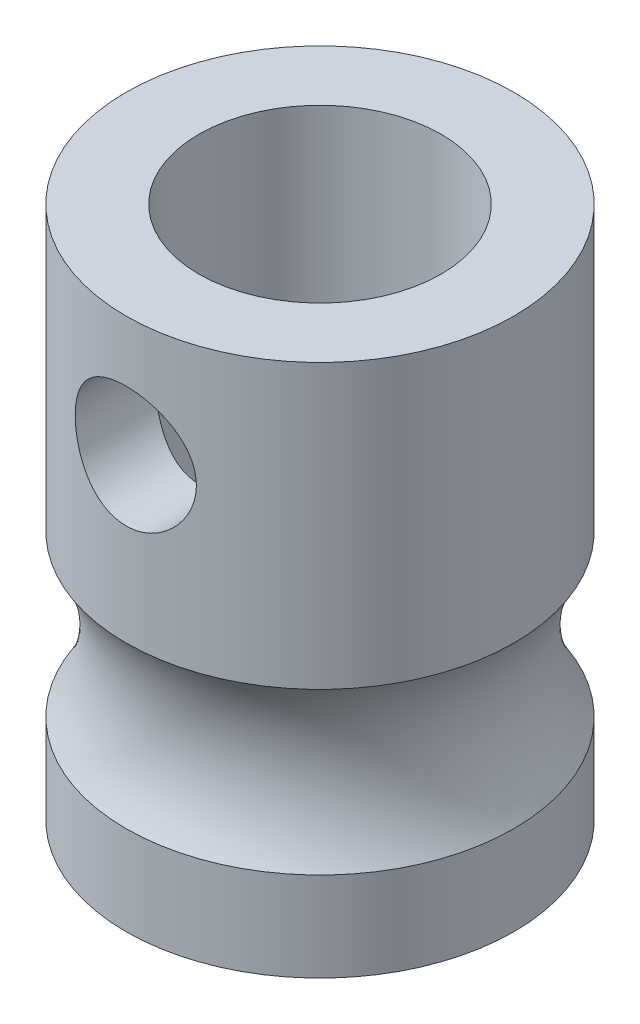
ISO-10303-21;
HEADER;
FILE_DESCRIPTION(('STEP AP214'),'2;1');
FILE_NAME('part.step','',(''),(''),'','','');
FILE_SCHEMA(('AUTOMOTIVE_DESIGN { 1 0 10303 214 1 1 1 1 }'));
ENDSEC;
DATA;
#1=APPLICATION_CONTEXT('core data for automotive mechanical design processes');
#2=APPLICATION_PROTOCOL_DEFINITION('international standard','automotive_design',2000,#1);
#3=PRODUCT_CONTEXT('',#1,'mechanical');
#4=PRODUCT('Part','Part','',(#3));
#5=PRODUCT_RELATED_PRODUCT_CATEGORY('part','',(#4));
#6=PRODUCT_DEFINITION_FORMATION('','',#4);
#7=PRODUCT_DEFINITION_CONTEXT('part definition',#1,'design');
#8=PRODUCT_DEFINITION('design','',#6,#7);
#9=PRODUCT_DEFINITION_SHAPE('','',#8);
#10=(LENGTH_UNIT() NAMED_UNIT(*) SI_UNIT(.MILLI.,.METRE.));
#11=(NAMED_UNIT(*) PLANE_ANGLE_UNIT() SI_UNIT($,.RADIAN.));
#12=(NAMED_UNIT(*) SI_UNIT($,.STERADIAN.) SOLID_ANGLE_UNIT());
#13=UNCERTAINTY_MEASURE_WITH_UNIT(LENGTH_MEASURE(1.E-05),#10,'distance_accuracy_value','');
#14=(GEOMETRIC_REPRESENTATION_CONTEXT(3) GLOBAL_UNCERTAINTY_ASSIGNED_CONTEXT((#13)) GLOBAL_UNIT_ASSIGNED_CONTEXT((#10,
#11,#12)) REPRESENTATION_CONTEXT('',''));
#15=CARTESIAN_POINT('',(0.,0.,0.));
#16=DIRECTION('',(0.,0.,1.));
#17=DIRECTION('',(1.,0.,0.));
#18=AXIS2_PLACEMENT_3D('',#15,#16,#17);
#19=CARTESIAN_POINT('',(0.,11.,0.));
#20=DIRECTION('',(0.,-1.,0.));
#21=DIRECTION('',(0.,0.,-1.));
#22=AXIS2_PLACEMENT_3D('',#19,#20,#21);
#23=CYLINDRICAL_SURFACE('',#22,4.);
#24=CARTESIAN_POINT('',(0.,11.,0.));
#25=DIRECTION('',(0.,1.,0.));
#26=DIRECTION('',(0.,0.,1.));
#27=AXIS2_PLACEMENT_3D('',#24,#25,#26);
#28=CIRCLE('',#27,4.);
#29=CARTESIAN_POINT('',(0.,11.,4.));
#30=VERTEX_POINT('',#29);
#31=EDGE_CURVE('E10',#30,#30,#28,.T.);
#32=ORIENTED_EDGE('',*,*,#31,.F.);
#33=EDGE_LOOP('',(#32));
#34=FACE_BOUND('',#33,.T.);
#35=CARTESIAN_POINT('',(1.25,8.5,3.79967103839267));
#36=CARTESIAN_POINT('',(1.24999953780047,8.43165296389066,3.79967145961936));
#37=CARTESIAN_POINT('',(1.24437538791494,8.3633012312968,3.80153531505043));
#38=CARTESIAN_POINT('',(1.22209175401327,8.22860583912219,3.80875638998877));
#39=CARTESIAN_POINT('',(1.20542928782515,8.16226272726784,3.81411455353136));
#40=CARTESIAN_POINT('',(1.16169788223559,8.033555098068,3.8276593883596));
#41=CARTESIAN_POINT('',(1.13464735736677,7.97118376689432,3.83584105194317));
#42=CARTESIAN_POINT('',(1.07096914173157,7.85184730413599,3.85410406218688));
#43=CARTESIAN_POINT('',(1.03433975905632,7.79488313003988,3.86418574435841));
#44=CARTESIAN_POINT('',(0.951196070622294,7.68602113250651,3.8855012766862));
#45=CARTESIAN_POINT('',(0.904409399720399,7.63433639056402,3.8967612338478));
#46=CARTESIAN_POINT('',(0.802862046455496,7.53940398679082,3.91894245860335));
#47=CARTESIAN_POINT('',(0.748100252518566,7.49615750305515,3.92986367872627));
#48=CARTESIAN_POINT('',(0.630625912493364,7.41838893698876,3.95043553390078));
#49=CARTESIAN_POINT('',(0.567761556520096,7.38408629616854,3.9600518456278));
#50=CARTESIAN_POINT('',(0.436804232853405,7.32662395014445,3.97662551833019));
#51=CARTESIAN_POINT('',(0.368712498487053,7.30346162585041,3.98358350419919));
#52=CARTESIAN_POINT('',(0.231464356966099,7.26964887190293,3.99387175820863));
#53=CARTESIAN_POINT('',(0.162405715468217,7.25863425021215,3.99730738984143));
#54=CARTESIAN_POINT('',(0.0233408139845221,7.24827565356247,4.00053595876015));
#55=CARTESIAN_POINT('',(-0.0466652269730815,7.24892902564117,4.00032972410065));
#56=CARTESIAN_POINT('',(-0.183074480354733,7.26164829158594,3.99637116132537));
#57=CARTESIAN_POINT('',(-0.249518634314042,7.27331938351302,3.99274150972157));
#58=CARTESIAN_POINT('',(-0.379453063347768,7.307094990043,3.98249482560855));
#59=CARTESIAN_POINT('',(-0.442943145481194,7.32920018508655,3.97587759827134));
#60=CARTESIAN_POINT('',(-0.566078103154779,7.38347018907488,3.96023459729533));
#61=CARTESIAN_POINT('',(-0.625666405622829,7.41575480856303,3.95118033616957));
#62=CARTESIAN_POINT('',(-0.738702511152028,7.48937109970456,3.93161722953562));
#63=CARTESIAN_POINT('',(-0.792148756208836,7.53070505913783,3.92110801644584));
#64=CARTESIAN_POINT('',(-0.893737698453879,7.62327363480129,3.89923670734646));
#65=CARTESIAN_POINT('',(-0.941566549094176,7.6748490688412,3.88785731989084));
#66=CARTESIAN_POINT('',(-1.02798974259537,7.78539510182446,3.86590615440412));
#67=CARTESIAN_POINT('',(-1.06658299775341,7.844366570575,3.85533447159847));
#68=CARTESIAN_POINT('',(-1.13380465019765,7.96891746885984,3.83610846648974));
#69=CARTESIAN_POINT('',(-1.16231680702682,8.03456340904239,3.82747690354324));
#70=CARTESIAN_POINT('',(-1.20778345948513,8.17005949189535,3.81337545338913));
#71=CARTESIAN_POINT('',(-1.22474210765793,8.23990811421048,3.80790443033294));
#72=CARTESIAN_POINT('',(-1.24601485185709,8.37881995256583,3.80099563391872));
#73=CARTESIAN_POINT('',(-1.25080954353711,8.4478019962321,3.79940466389696));
#74=CARTESIAN_POINT('',(-1.24896744498307,8.58558974149816,3.80001077463984));
#75=CARTESIAN_POINT('',(-1.24233242111456,8.65439546870046,3.80220727008389));
#76=CARTESIAN_POINT('',(-1.21824873513143,8.78780829665164,3.80998957482874));
#77=CARTESIAN_POINT('',(-1.20111831160538,8.85247927407399,3.81547554101732));
#78=CARTESIAN_POINT('',(-1.15690373661028,8.97802179199604,3.82911287331661));
#79=CARTESIAN_POINT('',(-1.12981796171155,9.03889271092119,3.83726467412388));
#80=CARTESIAN_POINT('',(-1.06557510655875,9.15703910977175,3.85560539653156));
#81=CARTESIAN_POINT('',(-1.02815147488557,9.21416141559277,3.86584603489733));
#82=CARTESIAN_POINT('',(-0.944606408679812,9.32149034636191,3.88710348972828));
#83=CARTESIAN_POINT('',(-0.898482714690784,9.37169516892533,3.89812050735703));
#84=CARTESIAN_POINT('',(-0.796572947753606,9.46591036591281,3.92024187562679));
#85=CARTESIAN_POINT('',(-0.740465649788522,9.50957778613986,3.93133092285679));
#86=CARTESIAN_POINT('',(-0.621451545651399,9.58689104332125,3.95189059843678));
#87=CARTESIAN_POINT('',(-0.558545051108625,9.62053733931103,3.96136130090946));
#88=CARTESIAN_POINT('',(-0.428105523331833,9.67653056247168,3.97756311928512));
#89=CARTESIAN_POINT('',(-0.360610184283757,9.69895928784368,3.984313995612));
#90=CARTESIAN_POINT('',(-0.22255725405639,9.7320725385897,3.99440242648576));
#91=CARTESIAN_POINT('',(-0.152000628340358,9.74276073908349,3.99774104914277));
#92=CARTESIAN_POINT('',(-0.0129849366489001,9.75179100174962,4.00055803404462));
#93=CARTESIAN_POINT('',(0.055439191946521,9.75062845017075,4.0001912940739));
#94=CARTESIAN_POINT('',(0.191073221923247,9.7371881889513,3.99600978081049));
#95=CARTESIAN_POINT('',(0.258283202179567,9.72491120400805,3.99219523232619));
#96=CARTESIAN_POINT('',(0.38875511848079,9.68990599077772,3.98159570844796));
#97=CARTESIAN_POINT('',(0.452055918449479,9.66731039215463,3.97484847960205));
#98=CARTESIAN_POINT('',(0.573998425500089,9.61242917279152,3.9590794558795));
#99=CARTESIAN_POINT('',(0.63263933127448,9.58014189002657,3.95005727091358));
#100=CARTESIAN_POINT('',(0.745761694969687,9.50552724165556,3.93029896883376));
#101=CARTESIAN_POINT('',(0.800034607053109,9.46289647753603,3.91951509750962));
#102=CARTESIAN_POINT('',(0.900820791399317,9.36934011055654,3.89758736547061));
#103=CARTESIAN_POINT('',(0.947331733504159,9.31841202586061,3.88644339784827));
#104=CARTESIAN_POINT('',(1.03282865911252,9.2076842801589,3.86461892577438));
#105=CARTESIAN_POINT('',(1.07151427994711,9.14764659688342,3.85396600863456));
#106=CARTESIAN_POINT('',(1.13820470748521,9.02160187973086,3.83480125279531));
#107=CARTESIAN_POINT('',(1.16621383403546,8.95559727354975,3.82628854861387));
#108=CARTESIAN_POINT('',(1.20871180435792,8.82527738268533,3.81306560440328));
#109=CARTESIAN_POINT('',(1.22414939837873,8.76129745254843,3.80809315043749));
#110=CARTESIAN_POINT('',(1.244792458161,8.63154616790351,3.80139606482399));
#111=CARTESIAN_POINT('',(1.25000044480778,8.5657752587985,3.79967063301598));
#112=CARTESIAN_POINT('',(1.25,8.5,3.79967103839267));
#113=B_SPLINE_CURVE_WITH_KNOTS('',3,(#35,#36,#37,#38,#39,#40,#41,#42,#43,#44,#45,#46,#47,#48,
#49,#50,#51,#52,#53,#54,#55,#56,#57,#58,#59,#60,#61,#62,#63,#64,#65,#66,#67,#68,#69,#70,#71,#72,
#73,#74,#75,#76,#77,#78,#79,#80,#81,#82,#83,#84,#85,#86,#87,#88,#89,#90,#91,#92,#93,#94,#95,#96,
#97,#98,#99,#100,#101,#102,#103,#104,#105,#106,#107,#108,#109,#110,#111,#112),.UNSPECIFIED.,.T.,
.F.,(4,2,2,2,2,2,2,2,2,2,2,2,2,2,2,2,2,2,2,2,2,2,2,2,2,2,2,2,2,2,2,2,2,2,2,2,2,2,4),(0.,
0.204798137548489,0.409651627059734,0.614143644118581,0.818671804924946,1.02957080550838,
1.24049922941122,1.45619821963733,1.67184647417922,1.88083722835533,2.08978046471774,
2.2915098296975,2.49325235190093,2.69746404608409,2.90172742713187,3.11450338937334,
3.32730439853776,3.54248470934454,3.75758763952752,3.96404933287935,4.17047912219089,
4.37093972044363,4.5714330225321,4.77767613309611,4.9839728801188,5.19881937811511,
5.41365603317086,5.62690239290998,5.84008198140585,6.04438802439525,6.24868074692307,
6.45041846514759,6.65219079911652,6.86080693105215,7.0694855777219,7.28507795501705,
7.50058300803822,7.69772354371386,7.89481549188779),.UNSPECIFIED.);
#114=CARTESIAN_POINT('',(1.25,8.5,3.79967103839267));
#115=VERTEX_POINT('',#114);
#116=EDGE_CURVE('E58',#115,#115,#113,.T.);
#117=ORIENTED_EDGE('',*,*,#116,.T.);
#118=EDGE_LOOP('',(#117));
#119=FACE_BOUND('',#118,.T.);
#120=CARTESIAN_POINT('',(0.,5.1583123951777,0.));
#121=DIRECTION('',(0.,-1.,0.));
#122=DIRECTION('',(0.,0.,-1.));
#123=AXIS2_PLACEMENT_3D('',#120,#121,#122);
#124=CIRCLE('',#123,4.);
#125=CARTESIAN_POINT('',(0.,5.1583123951777,-4.));
#126=VERTEX_POINT('',#125);
#127=EDGE_CURVE('E35',#126,#126,#124,.T.);
#128=ORIENTED_EDGE('',*,*,#127,.F.);
#129=EDGE_LOOP('',(#128));
#130=FACE_BOUND('',#129,.T.);
#131=ADVANCED_FACE('F31',(#34,#119,#130),#23,.T.);
#132=CARTESIAN_POINT('',(0.,0.,0.));
#133=DIRECTION('',(0.,1.,0.));
#134=DIRECTION('',(0.,0.,1.));
#135=AXIS2_PLACEMENT_3D('',#132,#133,#134);
#136=CIRCLE('',#135,4.);
#137=CARTESIAN_POINT('',(0.,0.,4.));
#138=VERTEX_POINT('',#137);
#139=EDGE_CURVE('E39',#138,#138,#136,.T.);
#140=ORIENTED_EDGE('',*,*,#139,.T.);
#141=EDGE_LOOP('',(#140));
#142=FACE_BOUND('',#141,.T.);
#143=CARTESIAN_POINT('',(0.,1.8416876048223,0.));
#144=DIRECTION('',(0.,1.,0.));
#145=DIRECTION('',(0.,0.,1.));
#146=AXIS2_PLACEMENT_3D('',#143,#144,#145);
#147=CIRCLE('',#146,4.);
#148=CARTESIAN_POINT('',(0.,1.8416876048223,4.));
#149=VERTEX_POINT('',#148);
#150=EDGE_CURVE('E49',#149,#149,#147,.T.);
#151=ORIENTED_EDGE('',*,*,#150,.F.);
#152=EDGE_LOOP('',(#151));
#153=FACE_BOUND('',#152,.T.);
#154=ADVANCED_FACE('F83',(#142,#153),#23,.T.);
#155=CARTESIAN_POINT('',(0.,11.,0.));
#156=DIRECTION('',(0.,1.,0.));
#157=DIRECTION('',(0.,0.,1.));
#158=AXIS2_PLACEMENT_3D('',#155,#156,#157);
#159=PLANE('',#158);
#160=ORIENTED_EDGE('',*,*,#31,.T.);
#161=EDGE_LOOP('',(#160));
#162=FACE_BOUND('',#161,.T.);
#163=CARTESIAN_POINT('',(0.,11.,0.));
#164=DIRECTION('',(0.,1.,0.));
#165=DIRECTION('',(0.,0.,1.));
#166=AXIS2_PLACEMENT_3D('',#163,#164,#165);
#167=CIRCLE('',#166,2.5);
#168=CARTESIAN_POINT('',(0.,11.,2.5));
#169=VERTEX_POINT('',#168);
#170=EDGE_CURVE('E44',#169,#169,#167,.T.);
#171=ORIENTED_EDGE('',*,*,#170,.F.);
#172=EDGE_LOOP('',(#171));
#173=FACE_BOUND('',#172,.T.);
#174=ADVANCED_FACE('F88',(#162,#173),#159,.T.);
#175=CARTESIAN_POINT('',(0.,0.,0.));
#176=DIRECTION('',(0.,1.,0.));
#177=DIRECTION('',(0.,0.,1.));
#178=AXIS2_PLACEMENT_3D('',#175,#176,#177);
#179=PLANE('',#178);
#180=ORIENTED_EDGE('',*,*,#139,.F.);
#181=EDGE_LOOP('',(#180));
#182=FACE_BOUND('',#181,.T.);
#183=CARTESIAN_POINT('',(0.,0.,0.));
#184=DIRECTION('',(0.,1.,0.));
#185=DIRECTION('',(0.,0.,1.));
#186=AXIS2_PLACEMENT_3D('',#183,#184,#185);
#187=CIRCLE('',#186,2.5);
#188=CARTESIAN_POINT('',(0.,0.,2.5));
#189=VERTEX_POINT('',#188);
#190=EDGE_CURVE('E47',#189,#189,#187,.T.);
#191=ORIENTED_EDGE('',*,*,#190,.T.);
#192=EDGE_LOOP('',(#191));
#193=FACE_BOUND('',#192,.T.);
#194=ADVANCED_FACE('F97',(#182,#193),#179,.F.);
#195=CARTESIAN_POINT('',(0.,11.,0.));
#196=DIRECTION('',(0.,-1.,0.));
#197=DIRECTION('',(0.,0.,-1.));
#198=AXIS2_PLACEMENT_3D('',#195,#196,#197);
#199=CYLINDRICAL_SURFACE('',#198,2.5);
#200=CARTESIAN_POINT('',(1.25,8.5,2.1650635094611));
#201=CARTESIAN_POINT('',(1.24999545384316,8.43486523975594,2.16506918410574));
#202=CARTESIAN_POINT('',(1.24487496341652,8.36964823559369,2.16804751484696));
#203=CARTESIAN_POINT('',(1.22465401237257,8.24121591915356,2.17952958065065));
#204=CARTESIAN_POINT('',(1.20953258069272,8.17800510619574,2.18804492569449));
#205=CARTESIAN_POINT('',(1.17012493587476,8.05568541957007,2.20936683256748));
#206=CARTESIAN_POINT('',(1.14588744061716,7.99655668440801,2.22215054341565));
#207=CARTESIAN_POINT('',(1.08908440672046,7.8832197475041,2.25053331021072));
#208=CARTESIAN_POINT('',(1.05651841754472,7.82901181217193,2.26613251845081));
#209=CARTESIAN_POINT('',(0.980833175663598,7.72211783930312,2.29996086321802));
#210=CARTESIAN_POINT('',(0.937065045179713,7.66992608040807,2.31830079547442));
#211=CARTESIAN_POINT('',(0.841567259518085,7.57323951449161,2.35464978482132));
#212=CARTESIAN_POINT('',(0.789833657227866,7.5287485467706,2.37265867289062));
#213=CARTESIAN_POINT('',(0.675611954268182,7.44579106106542,2.40776846191186));
#214=CARTESIAN_POINT('',(0.612633986265718,7.40793279017559,2.42472633022716));
#215=CARTESIAN_POINT('',(0.48019628324938,7.3435739334428,2.45438445124411));
#216=CARTESIAN_POINT('',(0.410740672672694,7.31706617982854,2.46708738979677));
#217=CARTESIAN_POINT('',(0.272556179907471,7.27811917337363,2.48600576555297));
#218=CARTESIAN_POINT('',(0.204127238111022,7.26481309205558,2.49261850276115));
#219=CARTESIAN_POINT('',(0.0657132858723101,7.2497923516562,2.50009479807584));
#220=CARTESIAN_POINT('',(-0.00427075730467304,7.24807067900536,2.50096183480737));
#221=CARTESIAN_POINT('',(-0.137290655529687,7.25593334246294,2.49703727395563));
#222=CARTESIAN_POINT('',(-0.200401498970989,7.26454751940153,2.492731198652));
#223=CARTESIAN_POINT('',(-0.324142214897902,7.29110105488082,2.47967806574684));
#224=CARTESIAN_POINT('',(-0.384771901367407,7.30904111122028,2.47093067582992));
#225=CARTESIAN_POINT('',(-0.502886739461942,7.35385320761227,2.44964479109568));
#226=CARTESIAN_POINT('',(-0.560316779393973,7.38084539146508,2.43705551911499));
#227=CARTESIAN_POINT('',(-0.66997100189166,7.44282927025187,2.40922057483359));
#228=CARTESIAN_POINT('',(-0.722193311048307,7.47782382912794,2.39397395196855));
#229=CARTESIAN_POINT('',(-0.825217076122743,7.55861918941627,2.36055492999036));
#230=CARTESIAN_POINT('',(-0.8754175937867,7.60512878540751,2.34224219997719));
#231=CARTESIAN_POINT('',(-0.967630462872225,7.70573715616272,2.30567925733515));
#232=CARTESIAN_POINT('',(-1.00963651446779,7.75984171534258,2.28742910332036));
#233=CARTESIAN_POINT('',(-1.08688166830276,7.87831024053011,2.25180195115606));
#234=CARTESIAN_POINT('',(-1.12152164372256,7.94310752881776,2.23455399988384));
#235=CARTESIAN_POINT('',(-1.17914889125154,8.07867208919875,2.2046931284822));
#236=CARTESIAN_POINT('',(-1.20214832276361,8.14943304127195,2.19207537557584));
#237=CARTESIAN_POINT('',(-1.2339752637813,8.28901813910349,2.17430794771293));
#238=CARTESIAN_POINT('',(-1.24378140264997,8.35755139880444,2.1686456981062));
#239=CARTESIAN_POINT('',(-1.25189618326428,8.49550167689568,2.16397399202012));
#240=CARTESIAN_POINT('',(-1.25021294664378,8.56491803639973,2.16495983611639));
#241=CARTESIAN_POINT('',(-1.23629505417996,8.69456739822341,2.17292920675731));
#242=CARTESIAN_POINT('',(-1.22523477089058,8.75497431388491,2.17924484383318));
#243=CARTESIAN_POINT('',(-1.19462035579055,8.8729597328387,2.19617526939176));
#244=CARTESIAN_POINT('',(-1.17506347327952,8.93053731343326,2.20679145006292));
#245=CARTESIAN_POINT('',(-1.12705948575611,9.04426416362837,2.23170277599571));
#246=CARTESIAN_POINT('',(-1.0982425796159,9.10022377106694,2.24614554053829));
#247=CARTESIAN_POINT('',(-1.03285883001976,9.20683658942374,2.27695149371562));
#248=CARTESIAN_POINT('',(-0.99628800541527,9.2574870543916,2.29331566693934));
#249=CARTESIAN_POINT('',(-0.911046458998566,9.35872345940443,2.3285999807042));
#250=CARTESIAN_POINT('',(-0.861431590393707,9.40849643839707,2.34758228942861));
#251=CARTESIAN_POINT('',(-0.75425561924786,9.49926529749199,2.38417793722366));
#252=CARTESIAN_POINT('',(-0.696691843319183,9.54025821278817,2.40179081259637));
#253=CARTESIAN_POINT('',(-0.573169203198446,9.61321715743763,2.43426702113696));
#254=CARTESIAN_POINT('',(-0.507028871967641,9.64491639776364,2.44904552090037));
#255=CARTESIAN_POINT('',(-0.369402955801352,9.69642237982174,2.47354193699126));
#256=CARTESIAN_POINT('',(-0.29792212674022,9.71623956420788,2.48326429595466));
#257=CARTESIAN_POINT('',(-0.158724602913021,9.74171070521833,2.49584385227353));
#258=CARTESIAN_POINT('',(-0.0912643048130712,9.74849734484514,2.49924909885239));
#259=CARTESIAN_POINT('',(0.0439074824390046,9.751054081818,2.50052662968914));
#260=CARTESIAN_POINT('',(0.111618875368858,9.74682803565445,2.49840085083612));
#261=CARTESIAN_POINT('',(0.240672490396434,9.72822949150547,2.48917461047403));
#262=CARTESIAN_POINT('',(0.302140397264079,9.71454393842791,2.48241118334987));
#263=CARTESIAN_POINT('',(0.421807440229521,9.67834125087129,2.46490117079279));
#264=CARTESIAN_POINT('',(0.480006106194386,9.65582284988318,2.45415401415995));
#265=CARTESIAN_POINT('',(0.594279257806106,9.60159118479253,2.4290741343515));
#266=CARTESIAN_POINT('',(0.650156428375058,9.5695258459902,2.41460771498499));
#267=CARTESIAN_POINT('',(0.755968302267531,9.49755258642618,2.38360166427283));
#268=CARTESIAN_POINT('',(0.805900259268634,9.45764106360541,2.36706108197951));
#269=CARTESIAN_POINT('',(0.903642505196114,9.36650357622162,2.33160762783285));
#270=CARTESIAN_POINT('',(0.95074710567409,9.31454689065351,2.31262248764622));
#271=CARTESIAN_POINT('',(1.03582910924334,9.20318659858779,2.27578845203565));
#272=CARTESIAN_POINT('',(1.07379843751257,9.14377647391539,2.25794057202332));
#273=CARTESIAN_POINT('',(1.14053884973207,9.0167041917738,2.22499506631145));
#274=CARTESIAN_POINT('',(1.16898133245117,8.94884058608908,2.21000217820338));
#275=CARTESIAN_POINT('',(1.21359838688301,8.80833449457528,2.18582695410439));
#276=CARTESIAN_POINT('',(1.22981398896918,8.73570888885914,2.17662520184627));
#277=CARTESIAN_POINT('',(1.24295875983052,8.635243305435,2.16911590752238));
#278=CARTESIAN_POINT('',(1.24559513120481,8.60829013200264,2.1676016125644));
#279=CARTESIAN_POINT('',(1.24911675636245,8.55422939914719,2.16557419859688));
#280=CARTESIAN_POINT('',(1.25000189299984,8.52712182951766,2.16506114656387));
#281=CARTESIAN_POINT('',(1.25,8.5,2.1650635094611));
#282=B_SPLINE_CURVE_WITH_KNOTS('',3,(#200,#201,#202,#203,#204,#205,#206,#207,#208,#209,#210,
#211,#212,#213,#214,#215,#216,#217,#218,#219,#220,#221,#222,#223,#224,#225,#226,#227,#228,#229,
#230,#231,#232,#233,#234,#235,#236,#237,#238,#239,#240,#241,#242,#243,#244,#245,#246,#247,#248,
#249,#250,#251,#252,#253,#254,#255,#256,#257,#258,#259,#260,#261,#262,#263,#264,#265,#266,#267,
#268,#269,#270,#271,#272,#273,#274,#275,#276,#277,#278,#279,#280,#281),.UNSPECIFIED.,.T.,.F.,(4,
2,2,2,2,2,2,2,2,2,2,2,2,2,2,2,2,2,2,2,2,2,2,2,2,2,2,2,2,2,2,2,2,2,2,2,2,2,2,2,4),(0.,
0.195290153243392,0.390991116031006,0.585660744898609,0.780340906806437,0.991077890622793,
1.20191963855464,1.42697365298454,1.65188533704864,1.86079356209919,2.0695752960755,
2.26020121855673,2.45084140646819,2.64411918413933,2.8374662418784,3.04908989321113,
3.26087560307398,3.4861105216181,3.71110967764631,3.91827863567765,4.12530116485466,
4.30967729280032,4.49411315545079,4.68709120507609,4.88016857775059,5.09758429475766,
5.31507331222753,5.53830226766207,5.76133474760964,5.96390337986858,6.16640108492464,
6.35555531089365,6.54473666890016,6.7420093839934,6.93937287625899,7.15637802312584,
7.37357428556443,7.59763436298256,7.8209391625345,7.90225168981636,7.98356965618175),.UNSPECIFIED.);
#283=CARTESIAN_POINT('',(1.25,8.5,2.1650635094611));
#284=VERTEX_POINT('',#283);
#285=EDGE_CURVE('E54',#284,#284,#282,.T.);
#286=ORIENTED_EDGE('',*,*,#285,.F.);
#287=EDGE_LOOP('',(#286));
#288=FACE_BOUND('',#287,.T.);
#289=ORIENTED_EDGE('',*,*,#170,.T.);
#290=EDGE_LOOP('',(#289));
#291=FACE_BOUND('',#290,.T.);
#292=ORIENTED_EDGE('',*,*,#190,.F.);
#293=EDGE_LOOP('',(#292));
#294=FACE_BOUND('',#293,.T.);
#295=ADVANCED_FACE('F77',(#288,#291,#294),#199,.F.);
#296=CARTESIAN_POINT('',(0.,8.5,4.));
#297=DIRECTION('',(0.,0.,1.));
#298=DIRECTION('',(1.,0.,0.));
#299=AXIS2_PLACEMENT_3D('',#296,#297,#298);
#300=CYLINDRICAL_SURFACE('',#299,1.25);
#301=ORIENTED_EDGE('',*,*,#285,.T.);
#302=EDGE_LOOP('',(#301));
#303=FACE_BOUND('',#302,.T.);
#304=ORIENTED_EDGE('',*,*,#116,.F.);
#305=EDGE_LOOP('',(#304));
#306=FACE_BOUND('',#305,.T.);
#307=ADVANCED_FACE('F72',(#303,#306),#300,.F.);
#308=CARTESIAN_POINT('',(0.,3.5,0.));
#309=DIRECTION('',(0.,1.,0.));
#310=DIRECTION('',(0.,0.,1.));
#311=AXIS2_PLACEMENT_3D('',#308,#309,#310);
#312=TOROIDAL_SURFACE('',#311,6.5,3.);
#313=ORIENTED_EDGE('',*,*,#150,.T.);
#314=EDGE_LOOP('',(#313));
#315=FACE_BOUND('',#314,.T.);
#316=ORIENTED_EDGE('',*,*,#127,.T.);
#317=EDGE_LOOP('',(#316));
#318=FACE_BOUND('',#317,.T.);
#319=ADVANCED_FACE('F76',(#315,#318),#312,.F.);
#320=CLOSED_SHELL('',(#131,#154,#174,#194,#295,#307,#319));
#321=MANIFOLD_SOLID_BREP('B2',#320);
#322=ADVANCED_BREP_SHAPE_REPRESENTATION('',(#18,#321),#14);
#323=SHAPE_DEFINITION_REPRESENTATION(#9,#322);
ENDSEC;
END-ISO-10303-21;
